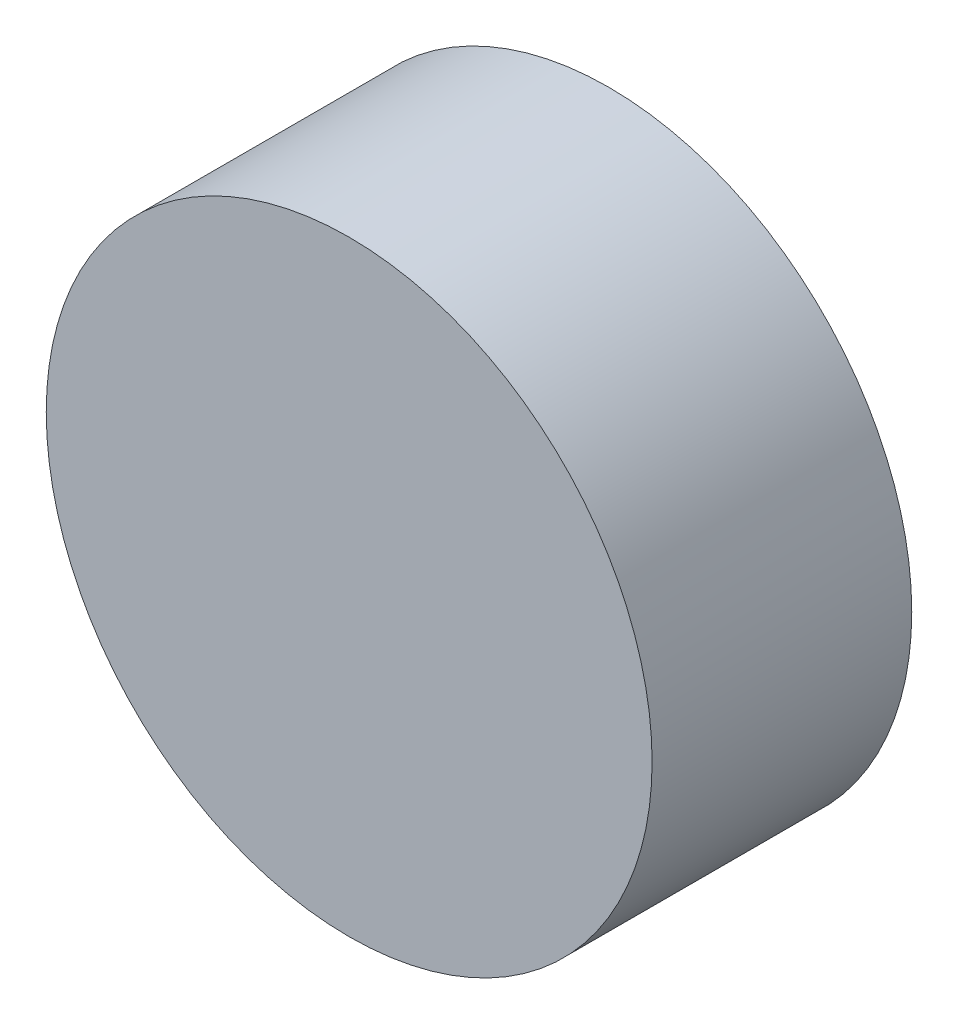
ISO-10303-21;
HEADER;
FILE_DESCRIPTION(('STEP AP214'),'2;1');
FILE_NAME('part.step','',(''),(''),'','','');
FILE_SCHEMA(('AUTOMOTIVE_DESIGN { 1 0 10303 214 1 1 1 1 }'));
ENDSEC;
DATA;
#1=APPLICATION_CONTEXT('core data for automotive mechanical design processes');
#2=APPLICATION_PROTOCOL_DEFINITION('international standard','automotive_design',2000,#1);
#3=PRODUCT_CONTEXT('',#1,'mechanical');
#4=PRODUCT('Part','Part','',(#3));
#5=PRODUCT_RELATED_PRODUCT_CATEGORY('part','',(#4));
#6=PRODUCT_DEFINITION_FORMATION('','',#4);
#7=PRODUCT_DEFINITION_CONTEXT('part definition',#1,'design');
#8=PRODUCT_DEFINITION('design','',#6,#7);
#9=PRODUCT_DEFINITION_SHAPE('','',#8);
#10=(LENGTH_UNIT() NAMED_UNIT(*) SI_UNIT(.MILLI.,.METRE.));
#11=(NAMED_UNIT(*) PLANE_ANGLE_UNIT() SI_UNIT($,.RADIAN.));
#12=(NAMED_UNIT(*) SI_UNIT($,.STERADIAN.) SOLID_ANGLE_UNIT());
#13=UNCERTAINTY_MEASURE_WITH_UNIT(LENGTH_MEASURE(1.E-05),#10,'distance_accuracy_value','');
#14=(GEOMETRIC_REPRESENTATION_CONTEXT(3) GLOBAL_UNCERTAINTY_ASSIGNED_CONTEXT((#13)) GLOBAL_UNIT_ASSIGNED_CONTEXT((#10,
#11,#12)) REPRESENTATION_CONTEXT('',''));
#15=CARTESIAN_POINT('',(0.,0.,0.));
#16=DIRECTION('',(0.,0.,1.));
#17=DIRECTION('',(1.,0.,0.));
#18=AXIS2_PLACEMENT_3D('',#15,#16,#17);
#19=CARTESIAN_POINT('',(0.,0.,27.));
#20=DIRECTION('',(0.,0.,-1.));
#21=DIRECTION('',(-1.,0.,0.));
#22=AXIS2_PLACEMENT_3D('',#19,#20,#21);
#23=CYLINDRICAL_SURFACE('',#22,31.5);
#24=CARTESIAN_POINT('',(0.,0.,27.));
#25=DIRECTION('',(0.,0.,1.));
#26=DIRECTION('',(1.,0.,0.));
#27=AXIS2_PLACEMENT_3D('',#24,#25,#26);
#28=CIRCLE('',#27,31.5);
#29=CARTESIAN_POINT('',(31.5,0.,27.));
#30=VERTEX_POINT('',#29);
#31=EDGE_CURVE('E10',#30,#30,#28,.T.);
#32=ORIENTED_EDGE('',*,*,#31,.F.);
#33=EDGE_LOOP('',(#32));
#34=FACE_BOUND('',#33,.T.);
#35=CARTESIAN_POINT('',(0.,0.,0.));
#36=DIRECTION('',(0.,0.,1.));
#37=DIRECTION('',(1.,0.,0.));
#38=AXIS2_PLACEMENT_3D('',#35,#36,#37);
#39=CIRCLE('',#38,31.5);
#40=CARTESIAN_POINT('',(31.5,0.,0.));
#41=VERTEX_POINT('',#40);
#42=EDGE_CURVE('E33',#41,#41,#39,.T.);
#43=ORIENTED_EDGE('',*,*,#42,.T.);
#44=EDGE_LOOP('',(#43));
#45=FACE_BOUND('',#44,.T.);
#46=ADVANCED_FACE('F30',(#34,#45),#23,.T.);
#47=CARTESIAN_POINT('',(0.,0.,27.));
#48=DIRECTION('',(0.,0.,1.));
#49=DIRECTION('',(1.,0.,0.));
#50=AXIS2_PLACEMENT_3D('',#47,#48,#49);
#51=PLANE('',#50);
#52=ORIENTED_EDGE('',*,*,#31,.T.);
#53=EDGE_LOOP('',(#52));
#54=FACE_BOUND('',#53,.T.);
#55=ADVANCED_FACE('F45',(#54),#51,.T.);
#56=CARTESIAN_POINT('',(0.,0.,0.));
#57=DIRECTION('',(0.,0.,1.));
#58=DIRECTION('',(1.,0.,0.));
#59=AXIS2_PLACEMENT_3D('',#56,#57,#58);
#60=PLANE('',#59);
#61=ORIENTED_EDGE('',*,*,#42,.F.);
#62=EDGE_LOOP('',(#61));
#63=FACE_BOUND('',#62,.T.);
#64=ADVANCED_FACE('F43',(#63),#60,.F.);
#65=CLOSED_SHELL('',(#46,#55,#64));
#66=MANIFOLD_SOLID_BREP('B2',#65);
#67=ADVANCED_BREP_SHAPE_REPRESENTATION('',(#18,#66),#14);
#68=SHAPE_DEFINITION_REPRESENTATION(#9,#67);
ENDSEC;
END-ISO-10303-21;
